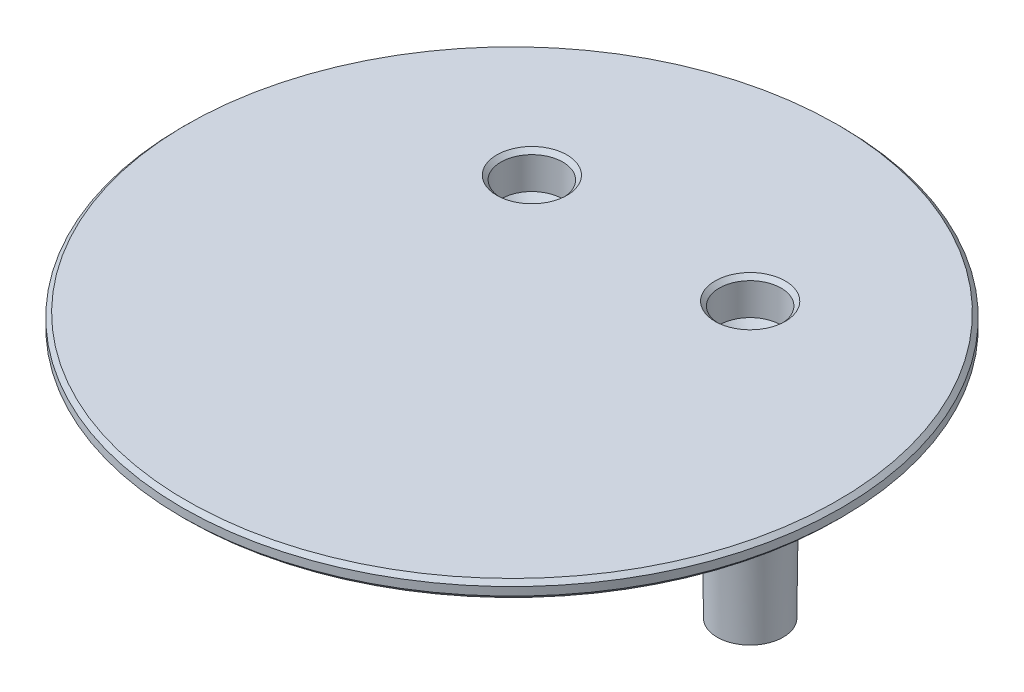
ISO-10303-21;
HEADER;
FILE_DESCRIPTION(('STEP AP214'),'2;1');
FILE_NAME('part.step','',(''),(''),'','','');
FILE_SCHEMA(('AUTOMOTIVE_DESIGN { 1 0 10303 214 1 1 1 1 }'));
ENDSEC;
DATA;
#1=APPLICATION_CONTEXT('core data for automotive mechanical design processes');
#2=APPLICATION_PROTOCOL_DEFINITION('international standard','automotive_design',2000,#1);
#3=PRODUCT_CONTEXT('',#1,'mechanical');
#4=PRODUCT('Part','Part','',(#3));
#5=PRODUCT_RELATED_PRODUCT_CATEGORY('part','',(#4));
#6=PRODUCT_DEFINITION_FORMATION('','',#4);
#7=PRODUCT_DEFINITION_CONTEXT('part definition',#1,'design');
#8=PRODUCT_DEFINITION('design','',#6,#7);
#9=PRODUCT_DEFINITION_SHAPE('','',#8);
#10=(LENGTH_UNIT() NAMED_UNIT(*) SI_UNIT(.MILLI.,.METRE.));
#11=(NAMED_UNIT(*) PLANE_ANGLE_UNIT() SI_UNIT($,.RADIAN.));
#12=(NAMED_UNIT(*) SI_UNIT($,.STERADIAN.) SOLID_ANGLE_UNIT());
#13=UNCERTAINTY_MEASURE_WITH_UNIT(LENGTH_MEASURE(1.E-05),#10,'distance_accuracy_value','');
#14=(GEOMETRIC_REPRESENTATION_CONTEXT(3) GLOBAL_UNCERTAINTY_ASSIGNED_CONTEXT((#13)) GLOBAL_UNIT_ASSIGNED_CONTEXT((#10,
#11,#12)) REPRESENTATION_CONTEXT('',''));
#15=CARTESIAN_POINT('',(0.,0.,0.));
#16=DIRECTION('',(0.,0.,1.));
#17=DIRECTION('',(1.,0.,0.));
#18=AXIS2_PLACEMENT_3D('',#15,#16,#17);
#19=CARTESIAN_POINT('',(0.,-1.6,0.));
#20=DIRECTION('',(0.,1.,0.));
#21=DIRECTION('',(0.,0.,1.));
#22=AXIS2_PLACEMENT_3D('',#19,#20,#21);
#23=CYLINDRICAL_SURFACE('',#22,31.9433366800321);
#24=CARTESIAN_POINT('',(0.,-1.20000000000001,0.));
#25=DIRECTION('',(0.,1.,0.));
#26=DIRECTION('',(0.,0.,1.));
#27=AXIS2_PLACEMENT_3D('',#24,#25,#26);
#28=CIRCLE('',#27,31.9433366800321);
#29=CARTESIAN_POINT('',(0.,-1.20000000000001,31.9433366800321));
#30=VERTEX_POINT('',#29);
#31=EDGE_CURVE('E68',#30,#30,#28,.T.);
#32=ORIENTED_EDGE('',*,*,#31,.T.);
#33=EDGE_LOOP('',(#32));
#34=FACE_BOUND('',#33,.T.);
#35=CARTESIAN_POINT('',(0.,-0.399999999999977,0.));
#36=DIRECTION('',(0.,1.,0.));
#37=DIRECTION('',(0.,0.,1.));
#38=AXIS2_PLACEMENT_3D('',#35,#36,#37);
#39=CIRCLE('',#38,31.9433366800321);
#40=CARTESIAN_POINT('',(0.,-0.399999999999977,-31.9433366800321));
#41=VERTEX_POINT('',#40);
#42=EDGE_CURVE('E71',#41,#41,#39,.F.);
#43=ORIENTED_EDGE('',*,*,#42,.T.);
#44=EDGE_LOOP('',(#43));
#45=FACE_BOUND('',#44,.T.);
#46=ADVANCED_FACE('F41',(#34,#45),#23,.T.);
#47=CARTESIAN_POINT('',(0.,-1.6,0.));
#48=DIRECTION('',(0.,1.,0.));
#49=DIRECTION('',(0.,0.,1.));
#50=AXIS2_PLACEMENT_3D('',#47,#48,#49);
#51=PLANE('',#50);
#52=CARTESIAN_POINT('',(0.,-1.6,0.));
#53=DIRECTION('',(0.,1.,0.));
#54=DIRECTION('',(0.,0.,1.));
#55=AXIS2_PLACEMENT_3D('',#52,#53,#54);
#56=CIRCLE('',#55,31.5433366800321);
#57=CARTESIAN_POINT('',(0.,-1.6,31.5433366800321));
#58=VERTEX_POINT('',#57);
#59=EDGE_CURVE('E65',#58,#58,#56,.F.);
#60=ORIENTED_EDGE('',*,*,#59,.T.);
#61=EDGE_LOOP('',(#60));
#62=FACE_BOUND('',#61,.T.);
#63=CARTESIAN_POINT('',(10.575,-1.6,-12.5));
#64=DIRECTION('',(0.,-1.,0.));
#65=DIRECTION('',(1.,0.,0.));
#66=AXIS2_PLACEMENT_3D('',#63,#64,#65);
#67=CIRCLE('',#66,5.52583713101253);
#68=CARTESIAN_POINT('',(16.1008371310125,-1.6,-12.5));
#69=VERTEX_POINT('',#68);
#70=EDGE_CURVE('E74',#69,#69,#67,.T.);
#71=ORIENTED_EDGE('',*,*,#70,.F.);
#72=EDGE_LOOP('',(#71));
#73=FACE_BOUND('',#72,.T.);
#74=CARTESIAN_POINT('',(-10.575,-1.6,-12.5));
#75=DIRECTION('',(0.,-1.,0.));
#76=DIRECTION('',(1.,0.,0.));
#77=AXIS2_PLACEMENT_3D('',#74,#75,#76);
#78=CIRCLE('',#77,5.52583713101253);
#79=CARTESIAN_POINT('',(-5.04916286898746,-1.6,-12.5));
#80=VERTEX_POINT('',#79);
#81=EDGE_CURVE('E77',#80,#80,#78,.T.);
#82=ORIENTED_EDGE('',*,*,#81,.F.);
#83=EDGE_LOOP('',(#82));
#84=FACE_BOUND('',#83,.T.);
#85=ADVANCED_FACE('F96',(#62,#73,#84),#51,.F.);
#86=CARTESIAN_POINT('',(0.,0.,0.));
#87=DIRECTION('',(0.,1.,0.));
#88=DIRECTION('',(0.,0.,1.));
#89=AXIS2_PLACEMENT_3D('',#86,#87,#88);
#90=PLANE('',#89);
#91=CARTESIAN_POINT('',(0.,0.,0.));
#92=DIRECTION('',(0.,1.,0.));
#93=DIRECTION('',(0.,0.,1.));
#94=AXIS2_PLACEMENT_3D('',#91,#92,#93);
#95=CIRCLE('',#94,31.5433366800321);
#96=CARTESIAN_POINT('',(0.,0.,-31.5433366800321));
#97=VERTEX_POINT('',#96);
#98=EDGE_CURVE('E53',#97,#97,#95,.T.);
#99=ORIENTED_EDGE('',*,*,#98,.T.);
#100=EDGE_LOOP('',(#99));
#101=FACE_BOUND('',#100,.T.);
#102=CARTESIAN_POINT('',(10.575,0.,-12.5));
#103=DIRECTION('',(0.,1.,0.));
#104=DIRECTION('',(0.,0.,1.));
#105=AXIS2_PLACEMENT_3D('',#102,#103,#104);
#106=CIRCLE('',#105,3.39999999999999);
#107=CARTESIAN_POINT('',(10.575,0.,-9.10000000000001));
#108=VERTEX_POINT('',#107);
#109=EDGE_CURVE('E57',#108,#108,#106,.F.);
#110=ORIENTED_EDGE('',*,*,#109,.T.);
#111=EDGE_LOOP('',(#110));
#112=FACE_BOUND('',#111,.T.);
#113=CARTESIAN_POINT('',(-10.575,0.,-12.5));
#114=DIRECTION('',(0.,1.,0.));
#115=DIRECTION('',(0.,0.,1.));
#116=AXIS2_PLACEMENT_3D('',#113,#114,#115);
#117=CIRCLE('',#116,3.39999999999997);
#118=CARTESIAN_POINT('',(-10.575,0.,-9.10000000000003));
#119=VERTEX_POINT('',#118);
#120=EDGE_CURVE('E62',#119,#119,#117,.F.);
#121=ORIENTED_EDGE('',*,*,#120,.T.);
#122=EDGE_LOOP('',(#121));
#123=FACE_BOUND('',#122,.T.);
#124=ADVANCED_FACE('F93',(#101,#112,#123),#90,.T.);
#125=CARTESIAN_POINT('',(-16.1008371310125,-26.6,-12.5));
#126=DIRECTION('',(0.,0.,1.));
#127=DIRECTION('',(0.,-1.,0.));
#128=AXIS2_PLACEMENT_3D('',#125,#126,#127);
#129=ELLIPSE('',#128,25.,2.32583713101252);
#130=CARTESIAN_POINT('',(-10.575,-26.6,-12.5));
#131=DIRECTION('',(0.,-1.,0.));
#132=AXIS1_PLACEMENT('',#130,#131);
#133=SURFACE_OF_REVOLUTION('',#129,#132);
#134=ORIENTED_EDGE('',*,*,#81,.T.);
#135=EDGE_LOOP('',(#134));
#136=FACE_BOUND('',#135,.T.);
#137=CARTESIAN_POINT('',(-10.575,-26.6,-12.5));
#138=DIRECTION('',(0.,-1.,0.));
#139=DIRECTION('',(1.,0.,0.));
#140=AXIS2_PLACEMENT_3D('',#137,#138,#139);
#141=CIRCLE('',#140,3.2);
#142=CARTESIAN_POINT('',(-7.375,-26.6,-12.5));
#143=VERTEX_POINT('',#142);
#144=EDGE_CURVE('E80',#143,#143,#141,.T.);
#145=ORIENTED_EDGE('',*,*,#144,.F.);
#146=EDGE_LOOP('',(#145));
#147=FACE_BOUND('',#146,.T.);
#148=ADVANCED_FACE('F88',(#136,#147),#133,.F.);
#149=CARTESIAN_POINT('',(-12.175,-26.6,-12.5));
#150=DIRECTION('',(0.,-1.,0.));
#151=DIRECTION('',(1.,0.,0.));
#152=AXIS2_PLACEMENT_3D('',#149,#150,#151);
#153=PLANE('',#152);
#154=CARTESIAN_POINT('',(-10.575,-26.6,-12.5));
#155=DIRECTION('',(0.,-1.,0.));
#156=DIRECTION('',(1.,0.,0.));
#157=AXIS2_PLACEMENT_3D('',#154,#155,#156);
#158=CIRCLE('',#157,1.6);
#159=CARTESIAN_POINT('',(-8.975,-26.6,-12.5));
#160=VERTEX_POINT('',#159);
#161=EDGE_CURVE('E282',#160,#160,#158,.T.);
#162=ORIENTED_EDGE('',*,*,#161,.F.);
#163=EDGE_LOOP('',(#162));
#164=FACE_BOUND('',#163,.T.);
#165=ORIENTED_EDGE('',*,*,#144,.T.);
#166=EDGE_LOOP('',(#165));
#167=FACE_BOUND('',#166,.T.);
#168=ADVANCED_FACE('F92',(#164,#167),#153,.T.);
#169=CARTESIAN_POINT('',(-10.575,-26.6,-12.5));
#170=DIRECTION('',(0.,-1.,0.));
#171=DIRECTION('',(1.,0.,0.));
#172=AXIS2_PLACEMENT_3D('',#169,#170,#171);
#173=CYLINDRICAL_SURFACE('',#172,3.);
#174=CARTESIAN_POINT('',(-10.575,-0.39999999999997,-12.5));
#175=DIRECTION('',(0.,1.,0.));
#176=DIRECTION('',(0.,0.,1.));
#177=AXIS2_PLACEMENT_3D('',#174,#175,#176);
#178=CIRCLE('',#177,3.);
#179=CARTESIAN_POINT('',(-10.575,-0.39999999999997,-9.5));
#180=VERTEX_POINT('',#179);
#181=EDGE_CURVE('E10',#180,#180,#178,.T.);
#182=ORIENTED_EDGE('',*,*,#181,.T.);
#183=EDGE_LOOP('',(#182));
#184=FACE_BOUND('',#183,.T.);
#185=CARTESIAN_POINT('',(-10.575,-3.5,-12.5));
#186=DIRECTION('',(0.,-1.,0.));
#187=DIRECTION('',(1.,0.,0.));
#188=AXIS2_PLACEMENT_3D('',#185,#186,#187);
#189=CIRCLE('',#188,3.);
#190=CARTESIAN_POINT('',(-7.57499999999999,-3.5,-12.5));
#191=VERTEX_POINT('',#190);
#192=EDGE_CURVE('E83',#191,#191,#189,.T.);
#193=ORIENTED_EDGE('',*,*,#192,.T.);
#194=EDGE_LOOP('',(#193));
#195=FACE_BOUND('',#194,.T.);
#196=ADVANCED_FACE('F222',(#184,#195),#173,.F.);
#197=CARTESIAN_POINT('',(-10.575,-3.5,-12.5));
#198=DIRECTION('',(0.,1.,0.));
#199=DIRECTION('',(-1.,0.,0.));
#200=AXIS2_PLACEMENT_3D('',#197,#198,#199);
#201=CONICAL_SURFACE('',#200,3.,0.78539816339745);
#202=CARTESIAN_POINT('',(-10.575,-4.9,-12.5));
#203=DIRECTION('',(0.,-1.,0.));
#204=DIRECTION('',(1.,0.,0.));
#205=AXIS2_PLACEMENT_3D('',#202,#203,#204);
#206=CIRCLE('',#205,1.6);
#207=CARTESIAN_POINT('',(-8.97499999999999,-4.9,-12.5));
#208=VERTEX_POINT('',#207);
#209=EDGE_CURVE('E284',#208,#208,#206,.T.);
#210=ORIENTED_EDGE('',*,*,#209,.T.);
#211=EDGE_LOOP('',(#210));
#212=FACE_BOUND('',#211,.T.);
#213=ORIENTED_EDGE('',*,*,#192,.F.);
#214=EDGE_LOOP('',(#213));
#215=FACE_BOUND('',#214,.T.);
#216=ADVANCED_FACE('F213',(#212,#215),#201,.F.);
#217=CARTESIAN_POINT('',(-10.575,-26.6,-12.5));
#218=DIRECTION('',(0.,-1.,0.));
#219=DIRECTION('',(1.,0.,0.));
#220=AXIS2_PLACEMENT_3D('',#217,#218,#219);
#221=CYLINDRICAL_SURFACE('',#220,1.6);
#222=ORIENTED_EDGE('',*,*,#161,.T.);
#223=EDGE_LOOP('',(#222));
#224=FACE_BOUND('',#223,.T.);
#225=ORIENTED_EDGE('',*,*,#209,.F.);
#226=EDGE_LOOP('',(#225));
#227=FACE_BOUND('',#226,.T.);
#228=ADVANCED_FACE('F204',(#224,#227),#221,.F.);
#229=CARTESIAN_POINT('',(16.1008371310125,-26.6,-12.5));
#230=DIRECTION('',(0.,0.,-1.));
#231=DIRECTION('',(0.,-1.,0.));
#232=AXIS2_PLACEMENT_3D('',#229,#230,#231);
#233=ELLIPSE('',#232,25.,2.32583713101252);
#234=CARTESIAN_POINT('',(10.575,-26.6,-12.5));
#235=DIRECTION('',(0.,-1.,0.));
#236=AXIS1_PLACEMENT('',#234,#235);
#237=SURFACE_OF_REVOLUTION('',#233,#236);
#238=ORIENTED_EDGE('',*,*,#70,.T.);
#239=EDGE_LOOP('',(#238));
#240=FACE_BOUND('',#239,.T.);
#241=CARTESIAN_POINT('',(10.575,-26.6,-12.5));
#242=DIRECTION('',(0.,1.,0.));
#243=DIRECTION('',(-1.,0.,0.));
#244=AXIS2_PLACEMENT_3D('',#241,#242,#243);
#245=CIRCLE('',#244,3.2);
#246=CARTESIAN_POINT('',(7.375,-26.6,-12.5));
#247=VERTEX_POINT('',#246);
#248=EDGE_CURVE('E279',#247,#247,#245,.T.);
#249=ORIENTED_EDGE('',*,*,#248,.T.);
#250=EDGE_LOOP('',(#249));
#251=FACE_BOUND('',#250,.T.);
#252=ADVANCED_FACE('F194',(#240,#251),#237,.F.);
#253=CARTESIAN_POINT('',(12.175,-26.6,-12.5));
#254=DIRECTION('',(0.,-1.,0.));
#255=DIRECTION('',(-1.,0.,0.));
#256=AXIS2_PLACEMENT_3D('',#253,#254,#255);
#257=PLANE('',#256);
#258=CARTESIAN_POINT('',(10.575,-26.6,-12.5));
#259=DIRECTION('',(0.,1.,0.));
#260=DIRECTION('',(-1.,0.,0.));
#261=AXIS2_PLACEMENT_3D('',#258,#259,#260);
#262=CIRCLE('',#261,1.6);
#263=CARTESIAN_POINT('',(8.975,-26.6,-12.5));
#264=VERTEX_POINT('',#263);
#265=EDGE_CURVE('E302',#264,#264,#262,.T.);
#266=ORIENTED_EDGE('',*,*,#265,.T.);
#267=EDGE_LOOP('',(#266));
#268=FACE_BOUND('',#267,.T.);
#269=ORIENTED_EDGE('',*,*,#248,.F.);
#270=EDGE_LOOP('',(#269));
#271=FACE_BOUND('',#270,.T.);
#272=ADVANCED_FACE('F185',(#268,#271),#257,.T.);
#273=CARTESIAN_POINT('',(10.575,-26.6,-12.5));
#274=DIRECTION('',(0.,-1.,0.));
#275=DIRECTION('',(-1.,0.,0.));
#276=AXIS2_PLACEMENT_3D('',#273,#274,#275);
#277=CYLINDRICAL_SURFACE('',#276,3.);
#278=CARTESIAN_POINT('',(10.575,-0.399999999999998,-12.5));
#279=DIRECTION('',(0.,1.,0.));
#280=DIRECTION('',(0.,0.,1.));
#281=AXIS2_PLACEMENT_3D('',#278,#279,#280);
#282=CIRCLE('',#281,3.);
#283=CARTESIAN_POINT('',(10.575,-0.399999999999998,-9.5));
#284=VERTEX_POINT('',#283);
#285=EDGE_CURVE('E49',#284,#284,#282,.T.);
#286=ORIENTED_EDGE('',*,*,#285,.T.);
#287=EDGE_LOOP('',(#286));
#288=FACE_BOUND('',#287,.T.);
#289=CARTESIAN_POINT('',(10.575,-3.5,-12.5));
#290=DIRECTION('',(0.,1.,0.));
#291=DIRECTION('',(-1.,0.,0.));
#292=AXIS2_PLACEMENT_3D('',#289,#290,#291);
#293=CIRCLE('',#292,3.);
#294=CARTESIAN_POINT('',(7.57499999999999,-3.5,-12.5));
#295=VERTEX_POINT('',#294);
#296=EDGE_CURVE('E277',#295,#295,#293,.T.);
#297=ORIENTED_EDGE('',*,*,#296,.F.);
#298=EDGE_LOOP('',(#297));
#299=FACE_BOUND('',#298,.T.);
#300=ADVANCED_FACE('F175',(#288,#299),#277,.F.);
#301=CARTESIAN_POINT('',(10.575,-3.5,-12.5));
#302=DIRECTION('',(0.,1.,0.));
#303=DIRECTION('',(1.,0.,0.));
#304=AXIS2_PLACEMENT_3D('',#301,#302,#303);
#305=CONICAL_SURFACE('',#304,3.,0.78539816339745);
#306=CARTESIAN_POINT('',(10.575,-4.9,-12.5));
#307=DIRECTION('',(0.,1.,0.));
#308=DIRECTION('',(-1.,0.,0.));
#309=AXIS2_PLACEMENT_3D('',#306,#307,#308);
#310=CIRCLE('',#309,1.6);
#311=CARTESIAN_POINT('',(8.97499999999999,-4.9,-12.5));
#312=VERTEX_POINT('',#311);
#313=EDGE_CURVE('E298',#312,#312,#310,.T.);
#314=ORIENTED_EDGE('',*,*,#313,.F.);
#315=EDGE_LOOP('',(#314));
#316=FACE_BOUND('',#315,.T.);
#317=ORIENTED_EDGE('',*,*,#296,.T.);
#318=EDGE_LOOP('',(#317));
#319=FACE_BOUND('',#318,.T.);
#320=ADVANCED_FACE('F165',(#316,#319),#305,.F.);
#321=CARTESIAN_POINT('',(10.575,-26.6,-12.5));
#322=DIRECTION('',(0.,-1.,0.));
#323=DIRECTION('',(-1.,0.,0.));
#324=AXIS2_PLACEMENT_3D('',#321,#322,#323);
#325=CYLINDRICAL_SURFACE('',#324,1.6);
#326=ORIENTED_EDGE('',*,*,#265,.F.);
#327=EDGE_LOOP('',(#326));
#328=FACE_BOUND('',#327,.T.);
#329=ORIENTED_EDGE('',*,*,#313,.T.);
#330=EDGE_LOOP('',(#329));
#331=FACE_BOUND('',#330,.T.);
#332=ADVANCED_FACE('F114',(#328,#331),#325,.F.);
#333=CARTESIAN_POINT('',(0.,-1.20000000000001,0.));
#334=DIRECTION('',(0.,1.,0.));
#335=DIRECTION('',(0.,0.,1.));
#336=AXIS2_PLACEMENT_3D('',#333,#334,#335);
#337=CONICAL_SURFACE('',#336,31.9433366800321,0.785398163397448);
#338=ORIENTED_EDGE('',*,*,#59,.F.);
#339=EDGE_LOOP('',(#338));
#340=FACE_BOUND('',#339,.T.);
#341=ORIENTED_EDGE('',*,*,#31,.F.);
#342=EDGE_LOOP('',(#341));
#343=FACE_BOUND('',#342,.T.);
#344=ADVANCED_FACE('F107',(#340,#343),#337,.T.);
#345=CARTESIAN_POINT('',(0.,0.,0.));
#346=DIRECTION('',(0.,-1.,0.));
#347=DIRECTION('',(0.,0.,-1.));
#348=AXIS2_PLACEMENT_3D('',#345,#346,#347);
#349=CONICAL_SURFACE('',#348,31.5433366800321,0.785398163397448);
#350=CARTESIAN_POINT('',(0.,-0.399999999999977,-31.9433366800321));
#351=CARTESIAN_POINT('',(0.,-0.39583333333331,-31.9391700133655));
#352=CARTESIAN_POINT('',(0.,-0.391666666666644,-31.9350033466988));
#353=CARTESIAN_POINT('',(0.,-0.383333333333311,-31.9266700133655));
#354=CARTESIAN_POINT('',(0.,-0.379166666666645,-31.9225033466988));
#355=CARTESIAN_POINT('',(0.,-0.370833333333312,-31.9141700133655));
#356=CARTESIAN_POINT('',(0.,-0.366666666666645,-31.9100033466988));
#357=CARTESIAN_POINT('',(0.,-0.358333333333313,-31.9016700133655));
#358=CARTESIAN_POINT('',(0.,-0.354166666666646,-31.8975033466988));
#359=CARTESIAN_POINT('',(0.,-0.345833333333313,-31.8891700133655));
#360=CARTESIAN_POINT('',(0.,-0.341666666666646,-31.8850033466988));
#361=CARTESIAN_POINT('',(0.,-0.333333333333314,-31.8766700133655));
#362=CARTESIAN_POINT('',(0.,-0.329166666666648,-31.8725033466988));
#363=CARTESIAN_POINT('',(0.,-0.320833333333315,-31.8641700133655));
#364=CARTESIAN_POINT('',(0.,-0.316666666666649,-31.8600033466988));
#365=CARTESIAN_POINT('',(0.,-0.308333333333315,-31.8516700133655));
#366=CARTESIAN_POINT('',(0.,-0.304166666666649,-31.8475033466988));
#367=CARTESIAN_POINT('',(0.,-0.295833333333316,-31.8391700133655));
#368=CARTESIAN_POINT('',(0.,-0.29166666666665,-31.8350033466988));
#369=CARTESIAN_POINT('',(0.,-0.283333333333317,-31.8266700133655));
#370=CARTESIAN_POINT('',(0.,-0.279166666666651,-31.8225033466988));
#371=CARTESIAN_POINT('',(0.,-0.270833333333318,-31.8141700133655));
#372=CARTESIAN_POINT('',(0.,-0.266666666666651,-31.8100033466988));
#373=CARTESIAN_POINT('',(0.,-0.258333333333318,-31.8016700133655));
#374=CARTESIAN_POINT('',(0.,-0.254166666666652,-31.7975033466988));
#375=CARTESIAN_POINT('',(0.,-0.245833333333319,-31.7891700133655));
#376=CARTESIAN_POINT('',(0.,-0.241666666666653,-31.7850033466988));
#377=CARTESIAN_POINT('',(0.,-0.23333333333332,-31.7766700133655));
#378=CARTESIAN_POINT('',(0.,-0.229166666666653,-31.7725033466988));
#379=CARTESIAN_POINT('',(0.,-0.220833333333321,-31.7641700133655));
#380=CARTESIAN_POINT('',(0.,-0.216666666666654,-31.7600033466988));
#381=CARTESIAN_POINT('',(0.,-0.208333333333321,-31.7516700133655));
#382=CARTESIAN_POINT('',(0.,-0.204166666666654,-31.7475033466988));
#383=CARTESIAN_POINT('',(0.,-0.195833333333322,-31.7391700133655));
#384=CARTESIAN_POINT('',(0.,-0.191666666666656,-31.7350033466988));
#385=CARTESIAN_POINT('',(0.,-0.183333333333323,-31.7266700133655));
#386=CARTESIAN_POINT('',(0.,-0.179166666666656,-31.7225033466988));
#387=CARTESIAN_POINT('',(0.,-0.170833333333323,-31.7141700133655));
#388=CARTESIAN_POINT('',(0.,-0.166666666666657,-31.7100033466988));
#389=CARTESIAN_POINT('',(0.,-0.158333333333324,-31.7016700133655));
#390=CARTESIAN_POINT('',(0.,-0.154166666666658,-31.6975033466988));
#391=CARTESIAN_POINT('',(0.,-0.145833333333325,-31.6891700133655));
#392=CARTESIAN_POINT('',(0.,-0.141666666666658,-31.6850033466988));
#393=CARTESIAN_POINT('',(0.,-0.133333333333326,-31.6766700133655));
#394=CARTESIAN_POINT('',(0.,-0.129166666666659,-31.6725033466988));
#395=CARTESIAN_POINT('',(0.,-0.120833333333326,-31.6641700133655));
#396=CARTESIAN_POINT('',(0.,-0.11666666666666,-31.6600033466988));
#397=CARTESIAN_POINT('',(0.,-0.108333333333327,-31.6516700133655));
#398=CARTESIAN_POINT('',(0.,-0.104166666666661,-31.6475033466988));
#399=CARTESIAN_POINT('',(0.,-0.0958333333333278,-31.6391700133655));
#400=CARTESIAN_POINT('',(0.,-0.0916666666666615,-31.6350033466988));
#401=CARTESIAN_POINT('',(0.,-0.0833333333333283,-31.6266700133655));
#402=CARTESIAN_POINT('',(0.,-0.0791666666666613,-31.6225033466988));
#403=CARTESIAN_POINT('',(0.,-0.0708333333333288,-31.6141700133655));
#404=CARTESIAN_POINT('',(0.,-0.0666666666666632,-31.6100033466988));
#405=CARTESIAN_POINT('',(0.,-0.0583333333333307,-31.6016700133655));
#406=CARTESIAN_POINT('',(0.,-0.0541666666666637,-31.5975033466988));
#407=CARTESIAN_POINT('',(0.,-0.0458333333333305,-31.5891700133655));
#408=CARTESIAN_POINT('',(0.,-0.0416666666666642,-31.5850033466988));
#409=CARTESIAN_POINT('',(0.,-0.0333333333333314,-31.5766700133655));
#410=CARTESIAN_POINT('',(0.,-0.029166666666665,-31.5725033466988));
#411=CARTESIAN_POINT('',(0.,-0.0208333333333321,-31.5641700133655));
#412=CARTESIAN_POINT('',(0.,-0.0166666666666657,-31.5600033466988));
#413=CARTESIAN_POINT('',(0.,-0.00833333333333286,-31.5516700133655));
#414=CARTESIAN_POINT('',(0.,-0.00416666666666644,-31.5475033466988));
#415=CARTESIAN_POINT('',(0.,0.,-31.5433366800321));
#416=B_SPLINE_CURVE_WITH_KNOTS('',3,(#350,#351,#352,#353,#354,#355,#356,#357,#358,#359,#360,
#361,#362,#363,#364,#365,#366,#367,#368,#369,#370,#371,#372,#373,#374,#375,#376,#377,#378,#379,
#380,#381,#382,#383,#384,#385,#386,#387,#388,#389,#390,#391,#392,#393,#394,#395,#396,#397,#398,
#399,#400,#401,#402,#403,#404,#405,#406,#407,#408,#409,#410,#411,#412,#413,#414,#415),
.UNSPECIFIED.,.F.,.F.,(4,2,2,2,2,2,2,2,2,2,2,2,2,2,2,2,2,2,2,2,2,2,2,2,2,2,2,2,2,2,2,2,4),(0.,
0.0176776695296622,0.0353553390593244,0.0530330085889866,0.0707106781186488,0.088388347648311,
0.106066017177978,0.12374368670764,0.141421356237302,0.159099025766965,0.176776695296627,
0.194454364826289,0.212132034355951,0.229809703885614,0.247487373415276,0.265165042944938,
0.2828427124746,0.300520382004267,0.318198051533929,0.335875721063592,0.353553390593254,
0.371231060122916,0.388908729652578,0.40658639918224,0.424264068711903,0.441941738241565,
0.459619407771227,0.477297077300894,0.494974746830556,0.512652416360219,0.530330085889881,
0.548007755419543,0.565685424949205),.UNSPECIFIED.);
#417=EDGE_CURVE('BSEAM113',#41,#97,#416,.T.);
#418=ORIENTED_EDGE('',*,*,#42,.F.);
#419=ORIENTED_EDGE('',*,*,#98,.F.);
#420=ORIENTED_EDGE('',*,*,#417,.T.);
#421=ORIENTED_EDGE('',*,*,#417,.F.);
#422=EDGE_LOOP('',(#418,#420,#419,#421));
#423=FACE_BOUND('',#422,.T.);
#424=ADVANCED_FACE('F113',(#423),#349,.T.);
#425=CARTESIAN_POINT('',(10.575,-0.399999999999998,-12.5));
#426=DIRECTION('',(0.,1.,0.));
#427=DIRECTION('',(0.,0.,1.));
#428=AXIS2_PLACEMENT_3D('',#425,#426,#427);
#429=CONICAL_SURFACE('',#428,3.,0.785398163397436);
#430=ORIENTED_EDGE('',*,*,#109,.F.);
#431=EDGE_LOOP('',(#430));
#432=FACE_BOUND('',#431,.T.);
#433=ORIENTED_EDGE('',*,*,#285,.F.);
#434=EDGE_LOOP('',(#433));
#435=FACE_BOUND('',#434,.T.);
#436=ADVANCED_FACE('F120',(#432,#435),#429,.F.);
#437=CARTESIAN_POINT('',(-10.575,0.,-12.5));
#438=DIRECTION('',(0.,1.,0.));
#439=DIRECTION('',(0.,0.,1.));
#440=AXIS2_PLACEMENT_3D('',#437,#438,#439);
#441=CONICAL_SURFACE('',#440,3.39999999999997,0.785398163397454);
#442=ORIENTED_EDGE('',*,*,#181,.F.);
#443=EDGE_LOOP('',(#442));
#444=FACE_BOUND('',#443,.T.);
#445=ORIENTED_EDGE('',*,*,#120,.F.);
#446=EDGE_LOOP('',(#445));
#447=FACE_BOUND('',#446,.T.);
#448=ADVANCED_FACE('F44',(#444,#447),#441,.F.);
#449=CLOSED_SHELL('',(#46,#85,#124,#148,#168,#196,#216,#228,#252,#272,#300,#320,#332,#344,#424,
#436,#448));
#450=MANIFOLD_SOLID_BREP('B2',#449);
#451=ADVANCED_BREP_SHAPE_REPRESENTATION('',(#18,#450),#14);
#452=SHAPE_DEFINITION_REPRESENTATION(#9,#451);
ENDSEC;
END-ISO-10303-21;
